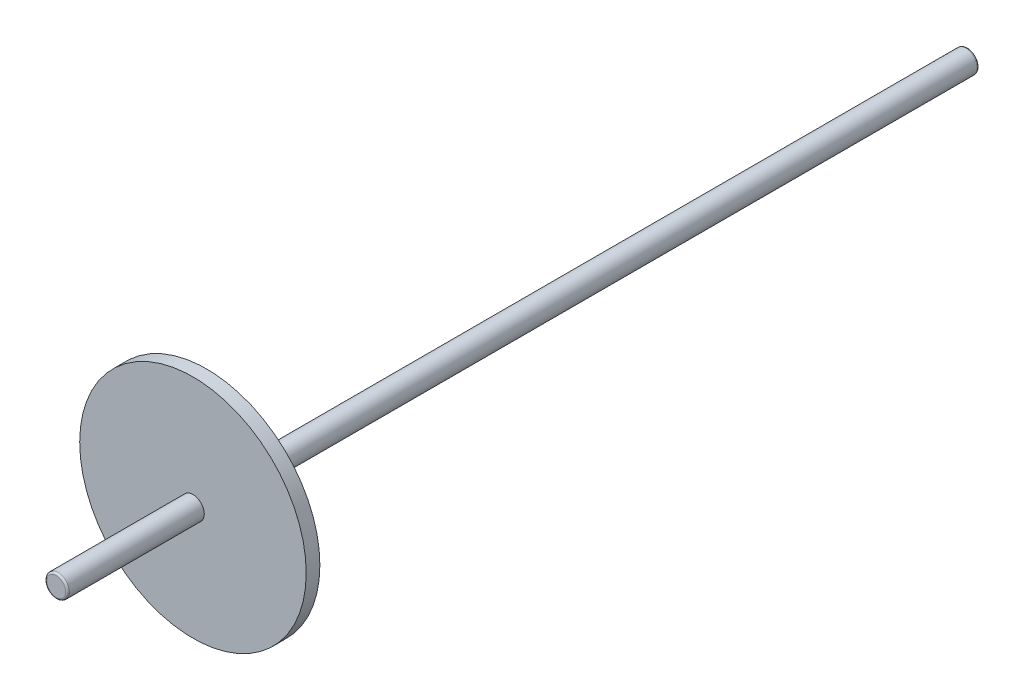
ISO-10303-21;
HEADER;
FILE_DESCRIPTION(('STEP AP214'),'2;1');
FILE_NAME('part.step','',(''),(''),'','','');
FILE_SCHEMA(('AUTOMOTIVE_DESIGN { 1 0 10303 214 1 1 1 1 }'));
ENDSEC;
DATA;
#1=APPLICATION_CONTEXT('core data for automotive mechanical design processes');
#2=APPLICATION_PROTOCOL_DEFINITION('international standard','automotive_design',2000,#1);
#3=PRODUCT_CONTEXT('',#1,'mechanical');
#4=PRODUCT('Part','Part','',(#3));
#5=PRODUCT_RELATED_PRODUCT_CATEGORY('part','',(#4));
#6=PRODUCT_DEFINITION_FORMATION('','',#4);
#7=PRODUCT_DEFINITION_CONTEXT('part definition',#1,'design');
#8=PRODUCT_DEFINITION('design','',#6,#7);
#9=PRODUCT_DEFINITION_SHAPE('','',#8);
#10=(LENGTH_UNIT() NAMED_UNIT(*) SI_UNIT(.MILLI.,.METRE.));
#11=(NAMED_UNIT(*) PLANE_ANGLE_UNIT() SI_UNIT($,.RADIAN.));
#12=(NAMED_UNIT(*) SI_UNIT($,.STERADIAN.) SOLID_ANGLE_UNIT());
#13=UNCERTAINTY_MEASURE_WITH_UNIT(LENGTH_MEASURE(1.E-05),#10,'distance_accuracy_value','');
#14=(GEOMETRIC_REPRESENTATION_CONTEXT(3) GLOBAL_UNCERTAINTY_ASSIGNED_CONTEXT((#13)) GLOBAL_UNIT_ASSIGNED_CONTEXT((#10,
#11,#12)) REPRESENTATION_CONTEXT('',''));
#15=CARTESIAN_POINT('',(0.,0.,0.));
#16=DIRECTION('',(0.,0.,1.));
#17=DIRECTION('',(1.,0.,0.));
#18=AXIS2_PLACEMENT_3D('',#15,#16,#17);
#19=CARTESIAN_POINT('',(0.,0.,1.5));
#20=DIRECTION('',(0.,0.,1.));
#21=DIRECTION('',(1.,0.,0.));
#22=AXIS2_PLACEMENT_3D('',#19,#20,#21);
#23=PLANE('',#22);
#24=CARTESIAN_POINT('',(0.,0.,1.5));
#25=DIRECTION('',(0.,0.,1.));
#26=DIRECTION('',(1.,0.,0.));
#27=AXIS2_PLACEMENT_3D('',#24,#25,#26);
#28=CIRCLE('',#27,12.425);
#29=CARTESIAN_POINT('',(12.425,0.,1.5));
#30=VERTEX_POINT('',#29);
#31=EDGE_CURVE('E53',#30,#30,#28,.T.);
#32=ORIENTED_EDGE('',*,*,#31,.T.);
#33=EDGE_LOOP('',(#32));
#34=FACE_BOUND('',#33,.T.);
#35=CARTESIAN_POINT('',(0.,0.,1.5));
#36=DIRECTION('',(0.,0.,1.));
#37=DIRECTION('',(1.,0.,0.));
#38=AXIS2_PLACEMENT_3D('',#35,#36,#37);
#39=CIRCLE('',#38,1.2415);
#40=CARTESIAN_POINT('',(1.2415,0.,1.5));
#41=VERTEX_POINT('',#40);
#42=EDGE_CURVE('E57',#41,#41,#39,.T.);
#43=ORIENTED_EDGE('',*,*,#42,.F.);
#44=EDGE_LOOP('',(#43));
#45=FACE_BOUND('',#44,.T.);
#46=ADVANCED_FACE('F33',(#34,#45),#23,.T.);
#47=CARTESIAN_POINT('',(0.,0.,0.));
#48=DIRECTION('',(0.,0.,1.));
#49=DIRECTION('',(1.,0.,0.));
#50=AXIS2_PLACEMENT_3D('',#47,#48,#49);
#51=PLANE('',#50);
#52=CARTESIAN_POINT('',(0.,0.,0.));
#53=DIRECTION('',(0.,0.,1.));
#54=DIRECTION('',(1.,0.,0.));
#55=AXIS2_PLACEMENT_3D('',#52,#53,#54);
#56=CIRCLE('',#55,2.2);
#57=CARTESIAN_POINT('',(2.2,0.,0.));
#58=VERTEX_POINT('',#57);
#59=EDGE_CURVE('E63',#58,#58,#56,.T.);
#60=ORIENTED_EDGE('',*,*,#59,.T.);
#61=EDGE_LOOP('',(#60));
#62=FACE_BOUND('',#61,.T.);
#63=CARTESIAN_POINT('',(0.,0.,0.));
#64=DIRECTION('',(0.,0.,1.));
#65=DIRECTION('',(1.,0.,0.));
#66=AXIS2_PLACEMENT_3D('',#63,#64,#65);
#67=CIRCLE('',#66,12.425);
#68=CARTESIAN_POINT('',(12.425,0.,0.));
#69=VERTEX_POINT('',#68);
#70=EDGE_CURVE('E54',#69,#69,#67,.T.);
#71=ORIENTED_EDGE('',*,*,#70,.F.);
#72=EDGE_LOOP('',(#71));
#73=FACE_BOUND('',#72,.T.);
#74=ADVANCED_FACE('F91',(#62,#73),#51,.F.);
#75=CARTESIAN_POINT('',(0.,0.,1.5));
#76=DIRECTION('',(0.,0.,-1.));
#77=DIRECTION('',(-1.,0.,0.));
#78=AXIS2_PLACEMENT_3D('',#75,#76,#77);
#79=CYLINDRICAL_SURFACE('',#78,12.425);
#80=ORIENTED_EDGE('',*,*,#31,.F.);
#81=EDGE_LOOP('',(#80));
#82=FACE_BOUND('',#81,.T.);
#83=ORIENTED_EDGE('',*,*,#70,.T.);
#84=EDGE_LOOP('',(#83));
#85=FACE_BOUND('',#84,.T.);
#86=ADVANCED_FACE('F97',(#82,#85),#79,.T.);
#87=CARTESIAN_POINT('',(0.,0.,-1.));
#88=DIRECTION('',(0.,0.,1.));
#89=DIRECTION('',(1.,0.,0.));
#90=AXIS2_PLACEMENT_3D('',#87,#88,#89);
#91=CYLINDRICAL_SURFACE('',#90,2.2);
#92=CARTESIAN_POINT('',(0.,0.,-1.));
#93=DIRECTION('',(0.,0.,1.));
#94=DIRECTION('',(1.,0.,0.));
#95=AXIS2_PLACEMENT_3D('',#92,#93,#94);
#96=CIRCLE('',#95,2.2);
#97=CARTESIAN_POINT('',(2.2,0.,-1.));
#98=VERTEX_POINT('',#97);
#99=EDGE_CURVE('E62',#98,#98,#96,.T.);
#100=ORIENTED_EDGE('',*,*,#99,.T.);
#101=EDGE_LOOP('',(#100));
#102=FACE_BOUND('',#101,.T.);
#103=ORIENTED_EDGE('',*,*,#59,.F.);
#104=EDGE_LOOP('',(#103));
#105=FACE_BOUND('',#104,.T.);
#106=ADVANCED_FACE('F102',(#102,#105),#91,.T.);
#107=CARTESIAN_POINT('',(0.,0.,-1.));
#108=DIRECTION('',(0.,0.,1.));
#109=DIRECTION('',(1.,0.,0.));
#110=AXIS2_PLACEMENT_3D('',#107,#108,#109);
#111=PLANE('',#110);
#112=CARTESIAN_POINT('',(0.,0.,-1.));
#113=DIRECTION('',(0.,0.,1.));
#114=DIRECTION('',(1.,0.,0.));
#115=AXIS2_PLACEMENT_3D('',#112,#113,#114);
#116=CIRCLE('',#115,1.2415);
#117=CARTESIAN_POINT('',(1.2415,0.,-1.));
#118=VERTEX_POINT('',#117);
#119=EDGE_CURVE('E66',#118,#118,#116,.T.);
#120=ORIENTED_EDGE('',*,*,#119,.T.);
#121=EDGE_LOOP('',(#120));
#122=FACE_BOUND('',#121,.T.);
#123=ORIENTED_EDGE('',*,*,#99,.F.);
#124=EDGE_LOOP('',(#123));
#125=FACE_BOUND('',#124,.T.);
#126=ADVANCED_FACE('F72',(#122,#125),#111,.F.);
#127=CARTESIAN_POINT('',(0.,0.,-83.5));
#128=DIRECTION('',(0.,0.,1.));
#129=DIRECTION('',(1.,0.,0.));
#130=AXIS2_PLACEMENT_3D('',#127,#128,#129);
#131=PLANE('',#130);
#132=CARTESIAN_POINT('',(0.,0.,-83.5));
#133=DIRECTION('',(0.,0.,1.));
#134=DIRECTION('',(1.,0.,0.));
#135=AXIS2_PLACEMENT_3D('',#132,#133,#134);
#136=CIRCLE('',#135,1.0415);
#137=CARTESIAN_POINT('',(1.0415,0.,-83.5));
#138=VERTEX_POINT('',#137);
#139=EDGE_CURVE('E44',#138,#138,#136,.F.);
#140=ORIENTED_EDGE('',*,*,#139,.T.);
#141=EDGE_LOOP('',(#140));
#142=FACE_BOUND('',#141,.T.);
#143=ADVANCED_FACE('F78',(#142),#131,.F.);
#144=CARTESIAN_POINT('',(0.,0.,-83.5));
#145=DIRECTION('',(0.,0.,1.));
#146=DIRECTION('',(1.,0.,0.));
#147=AXIS2_PLACEMENT_3D('',#144,#145,#146);
#148=CYLINDRICAL_SURFACE('',#147,1.2415);
#149=CARTESIAN_POINT('',(0.,0.,-83.3));
#150=DIRECTION('',(0.,0.,1.));
#151=DIRECTION('',(1.,0.,0.));
#152=AXIS2_PLACEMENT_3D('',#149,#150,#151);
#153=CIRCLE('',#152,1.2415);
#154=CARTESIAN_POINT('',(1.2415,0.,-83.3));
#155=VERTEX_POINT('',#154);
#156=EDGE_CURVE('E48',#155,#155,#153,.T.);
#157=ORIENTED_EDGE('',*,*,#156,.T.);
#158=EDGE_LOOP('',(#157));
#159=FACE_BOUND('',#158,.T.);
#160=ORIENTED_EDGE('',*,*,#119,.F.);
#161=EDGE_LOOP('',(#160));
#162=FACE_BOUND('',#161,.T.);
#163=ADVANCED_FACE('F75',(#159,#162),#148,.T.);
#164=CARTESIAN_POINT('',(0.,0.,16.3));
#165=DIRECTION('',(0.,0.,1.));
#166=DIRECTION('',(1.,0.,0.));
#167=AXIS2_PLACEMENT_3D('',#164,#165,#166);
#168=CIRCLE('',#167,1.2415);
#169=CARTESIAN_POINT('',(1.2415,0.,16.3));
#170=VERTEX_POINT('',#169);
#171=EDGE_CURVE('E10',#170,#170,#168,.F.);
#172=ORIENTED_EDGE('',*,*,#171,.T.);
#173=EDGE_LOOP('',(#172));
#174=FACE_BOUND('',#173,.T.);
#175=ORIENTED_EDGE('',*,*,#42,.T.);
#176=EDGE_LOOP('',(#175));
#177=FACE_BOUND('',#176,.T.);
#178=ADVANCED_FACE('F77',(#174,#177),#148,.T.);
#179=CARTESIAN_POINT('',(0.,0.,16.5));
#180=DIRECTION('',(0.,0.,1.));
#181=DIRECTION('',(1.,0.,0.));
#182=AXIS2_PLACEMENT_3D('',#179,#180,#181);
#183=PLANE('',#182);
#184=CARTESIAN_POINT('',(0.,0.,16.5));
#185=DIRECTION('',(0.,0.,1.));
#186=DIRECTION('',(1.,0.,0.));
#187=AXIS2_PLACEMENT_3D('',#184,#185,#186);
#188=CIRCLE('',#187,1.0415);
#189=CARTESIAN_POINT('',(1.0415,0.,16.5));
#190=VERTEX_POINT('',#189);
#191=EDGE_CURVE('E40',#190,#190,#188,.T.);
#192=ORIENTED_EDGE('',*,*,#191,.T.);
#193=EDGE_LOOP('',(#192));
#194=FACE_BOUND('',#193,.T.);
#195=ADVANCED_FACE('F85',(#194),#183,.T.);
#196=CARTESIAN_POINT('',(0.,0.,-83.3));
#197=DIRECTION('',(0.,0.,1.));
#198=DIRECTION('',(1.,0.,0.));
#199=AXIS2_PLACEMENT_3D('',#196,#197,#198);
#200=TOROIDAL_SURFACE('',#199,1.0415,0.2);
#201=ORIENTED_EDGE('',*,*,#139,.F.);
#202=EDGE_LOOP('',(#201));
#203=FACE_BOUND('',#202,.T.);
#204=ORIENTED_EDGE('',*,*,#156,.F.);
#205=EDGE_LOOP('',(#204));
#206=FACE_BOUND('',#205,.T.);
#207=ADVANCED_FACE('F106',(#203,#206),#200,.T.);
#208=CARTESIAN_POINT('',(0.,0.,16.3));
#209=DIRECTION('',(0.,0.,1.));
#210=DIRECTION('',(1.,0.,0.));
#211=AXIS2_PLACEMENT_3D('',#208,#209,#210);
#212=TOROIDAL_SURFACE('',#211,1.0415,0.2);
#213=ORIENTED_EDGE('',*,*,#171,.F.);
#214=EDGE_LOOP('',(#213));
#215=FACE_BOUND('',#214,.T.);
#216=ORIENTED_EDGE('',*,*,#191,.F.);
#217=EDGE_LOOP('',(#216));
#218=FACE_BOUND('',#217,.T.);
#219=ADVANCED_FACE('F35',(#215,#218),#212,.T.);
#220=CLOSED_SHELL('',(#46,#74,#86,#106,#126,#143,#163,#178,#195,#207,#219));
#221=MANIFOLD_SOLID_BREP('B2',#220);
#222=ADVANCED_BREP_SHAPE_REPRESENTATION('',(#18,#221),#14);
#223=SHAPE_DEFINITION_REPRESENTATION(#9,#222);
ENDSEC;
END-ISO-10303-21;
